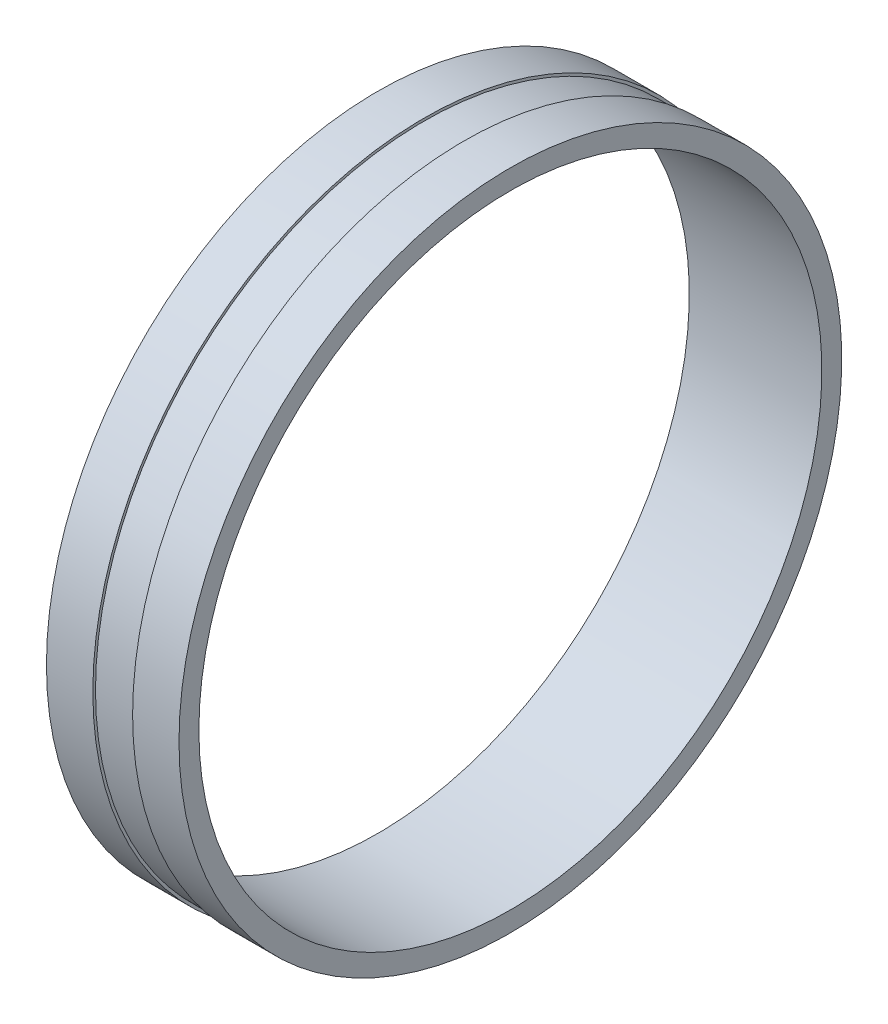
ISO-10303-21;
HEADER;
FILE_DESCRIPTION(('STEP AP214'),'2;1');
FILE_NAME('part.step','',(''),(''),'','','');
FILE_SCHEMA(('AUTOMOTIVE_DESIGN { 1 0 10303 214 1 1 1 1 }'));
ENDSEC;
DATA;
#1=APPLICATION_CONTEXT('core data for automotive mechanical design processes');
#2=APPLICATION_PROTOCOL_DEFINITION('international standard','automotive_design',2000,#1);
#3=PRODUCT_CONTEXT('',#1,'mechanical');
#4=PRODUCT('Part','Part','',(#3));
#5=PRODUCT_RELATED_PRODUCT_CATEGORY('part','',(#4));
#6=PRODUCT_DEFINITION_FORMATION('','',#4);
#7=PRODUCT_DEFINITION_CONTEXT('part definition',#1,'design');
#8=PRODUCT_DEFINITION('design','',#6,#7);
#9=PRODUCT_DEFINITION_SHAPE('','',#8);
#10=(LENGTH_UNIT() NAMED_UNIT(*) SI_UNIT(.MILLI.,.METRE.));
#11=(NAMED_UNIT(*) PLANE_ANGLE_UNIT() SI_UNIT($,.RADIAN.));
#12=(NAMED_UNIT(*) SI_UNIT($,.STERADIAN.) SOLID_ANGLE_UNIT());
#13=UNCERTAINTY_MEASURE_WITH_UNIT(LENGTH_MEASURE(1.E-05),#10,'distance_accuracy_value','');
#14=(GEOMETRIC_REPRESENTATION_CONTEXT(3) GLOBAL_UNCERTAINTY_ASSIGNED_CONTEXT((#13)) GLOBAL_UNIT_ASSIGNED_CONTEXT((#10,
#11,#12)) REPRESENTATION_CONTEXT('',''));
#15=CARTESIAN_POINT('',(0.,0.,0.));
#16=DIRECTION('',(0.,0.,1.));
#17=DIRECTION('',(1.,0.,0.));
#18=AXIS2_PLACEMENT_3D('',#15,#16,#17);
#19=CARTESIAN_POINT('',(-425.537809827157,-177.948573752576,0.));
#20=DIRECTION('',(1.,0.,0.));
#21=DIRECTION('',(0.,0.,-1.));
#22=AXIS2_PLACEMENT_3D('',#19,#20,#21);
#23=PLANE('',#22);
#24=CARTESIAN_POINT('',(-425.537809827157,-202.948573752576,0.));
#25=DIRECTION('',(-1.,0.,0.));
#26=DIRECTION('',(0.,0.,1.));
#27=AXIS2_PLACEMENT_3D('',#24,#25,#26);
#28=CIRCLE('',#27,23.5);
#29=CARTESIAN_POINT('',(-425.537809827157,-202.948573752576,23.5));
#30=VERTEX_POINT('',#29);
#31=EDGE_CURVE('E10',#30,#30,#28,.T.);
#32=ORIENTED_EDGE('',*,*,#31,.F.);
#33=EDGE_LOOP('',(#32));
#34=FACE_BOUND('',#33,.T.);
#35=CARTESIAN_POINT('',(-425.537809827157,-202.948573752576,0.));
#36=DIRECTION('',(-1.,0.,0.));
#37=DIRECTION('',(0.,0.,1.));
#38=AXIS2_PLACEMENT_3D('',#35,#36,#37);
#39=CIRCLE('',#38,25.);
#40=CARTESIAN_POINT('',(-425.537809827157,-202.948573752576,25.));
#41=VERTEX_POINT('',#40);
#42=EDGE_CURVE('E61',#41,#41,#39,.T.);
#43=ORIENTED_EDGE('',*,*,#42,.T.);
#44=EDGE_LOOP('',(#43));
#45=FACE_BOUND('',#44,.T.);
#46=ADVANCED_FACE('F33',(#34,#45),#23,.F.);
#47=CARTESIAN_POINT('',(-411.499100779652,-202.948573752576,0.));
#48=DIRECTION('',(-1.,0.,0.));
#49=DIRECTION('',(0.,0.,1.));
#50=AXIS2_PLACEMENT_3D('',#47,#48,#49);
#51=CYLINDRICAL_SURFACE('',#50,23.5);
#52=CARTESIAN_POINT('',(-415.537809827157,-202.948573752576,0.));
#53=DIRECTION('',(-1.,0.,0.));
#54=DIRECTION('',(0.,0.,1.));
#55=AXIS2_PLACEMENT_3D('',#52,#53,#54);
#56=CIRCLE('',#55,23.5);
#57=CARTESIAN_POINT('',(-415.537809827157,-202.948573752576,23.5));
#58=VERTEX_POINT('',#57);
#59=EDGE_CURVE('E39',#58,#58,#56,.T.);
#60=ORIENTED_EDGE('',*,*,#59,.F.);
#61=EDGE_LOOP('',(#60));
#62=FACE_BOUND('',#61,.T.);
#63=ORIENTED_EDGE('',*,*,#31,.T.);
#64=EDGE_LOOP('',(#63));
#65=FACE_BOUND('',#64,.T.);
#66=ADVANCED_FACE('F98',(#62,#65),#51,.F.);
#67=CARTESIAN_POINT('',(-415.537809827157,-177.948573752576,0.));
#68=DIRECTION('',(-1.,0.,0.));
#69=DIRECTION('',(0.,0.,1.));
#70=AXIS2_PLACEMENT_3D('',#67,#68,#69);
#71=PLANE('',#70);
#72=CARTESIAN_POINT('',(-415.537809827157,-202.948573752576,0.));
#73=DIRECTION('',(-1.,0.,0.));
#74=DIRECTION('',(0.,0.,1.));
#75=AXIS2_PLACEMENT_3D('',#72,#73,#74);
#76=CIRCLE('',#75,25.);
#77=CARTESIAN_POINT('',(-415.537809827157,-202.948573752576,25.));
#78=VERTEX_POINT('',#77);
#79=EDGE_CURVE('E43',#78,#78,#76,.T.);
#80=ORIENTED_EDGE('',*,*,#79,.F.);
#81=EDGE_LOOP('',(#80));
#82=FACE_BOUND('',#81,.T.);
#83=ORIENTED_EDGE('',*,*,#59,.T.);
#84=EDGE_LOOP('',(#83));
#85=FACE_BOUND('',#84,.T.);
#86=ADVANCED_FACE('F93',(#82,#85),#71,.F.);
#87=CARTESIAN_POINT('',(-411.499100779652,-202.948573752576,0.));
#88=DIRECTION('',(-1.,0.,0.));
#89=DIRECTION('',(0.,0.,1.));
#90=AXIS2_PLACEMENT_3D('',#87,#88,#89);
#91=CYLINDRICAL_SURFACE('',#90,25.);
#92=CARTESIAN_POINT('',(-419.037809827157,-202.948573752576,0.));
#93=DIRECTION('',(-1.,0.,0.));
#94=DIRECTION('',(0.,0.,1.));
#95=AXIS2_PLACEMENT_3D('',#92,#93,#94);
#96=CIRCLE('',#95,25.);
#97=CARTESIAN_POINT('',(-419.037809827157,-202.948573752576,25.));
#98=VERTEX_POINT('',#97);
#99=EDGE_CURVE('E47',#98,#98,#96,.T.);
#100=ORIENTED_EDGE('',*,*,#99,.F.);
#101=EDGE_LOOP('',(#100));
#102=FACE_BOUND('',#101,.T.);
#103=ORIENTED_EDGE('',*,*,#79,.T.);
#104=EDGE_LOOP('',(#103));
#105=FACE_BOUND('',#104,.T.);
#106=ADVANCED_FACE('F87',(#102,#105),#91,.T.);
#107=CARTESIAN_POINT('',(-419.037809827157,-177.948573752576,0.));
#108=DIRECTION('',(1.,0.,0.));
#109=DIRECTION('',(0.,0.,-1.));
#110=AXIS2_PLACEMENT_3D('',#107,#108,#109);
#111=PLANE('',#110);
#112=CARTESIAN_POINT('',(-419.037809827157,-202.948573752576,0.));
#113=DIRECTION('',(-1.,0.,0.));
#114=DIRECTION('',(0.,0.,1.));
#115=AXIS2_PLACEMENT_3D('',#112,#113,#114);
#116=CIRCLE('',#115,24.8);
#117=CARTESIAN_POINT('',(-419.037809827157,-202.948573752576,24.8));
#118=VERTEX_POINT('',#117);
#119=EDGE_CURVE('E52',#118,#118,#116,.T.);
#120=ORIENTED_EDGE('',*,*,#119,.F.);
#121=EDGE_LOOP('',(#120));
#122=FACE_BOUND('',#121,.T.);
#123=ORIENTED_EDGE('',*,*,#99,.T.);
#124=EDGE_LOOP('',(#123));
#125=FACE_BOUND('',#124,.T.);
#126=ADVANCED_FACE('F81',(#122,#125),#111,.F.);
#127=CARTESIAN_POINT('',(-411.499100779652,-202.948573752576,0.));
#128=DIRECTION('',(-1.,0.,0.));
#129=DIRECTION('',(0.,0.,1.));
#130=AXIS2_PLACEMENT_3D('',#127,#128,#129);
#131=CYLINDRICAL_SURFACE('',#130,24.8);
#132=CARTESIAN_POINT('',(-422.037809827157,-202.948573752576,0.));
#133=DIRECTION('',(-1.,0.,0.));
#134=DIRECTION('',(0.,0.,1.));
#135=AXIS2_PLACEMENT_3D('',#132,#133,#134);
#136=CIRCLE('',#135,24.8);
#137=CARTESIAN_POINT('',(-422.037809827157,-202.948573752576,24.8));
#138=VERTEX_POINT('',#137);
#139=EDGE_CURVE('E55',#138,#138,#136,.T.);
#140=ORIENTED_EDGE('',*,*,#139,.F.);
#141=EDGE_LOOP('',(#140));
#142=FACE_BOUND('',#141,.T.);
#143=ORIENTED_EDGE('',*,*,#119,.T.);
#144=EDGE_LOOP('',(#143));
#145=FACE_BOUND('',#144,.T.);
#146=ADVANCED_FACE('F75',(#142,#145),#131,.T.);
#147=CARTESIAN_POINT('',(-422.037809827157,-177.948573752576,0.));
#148=DIRECTION('',(-1.,0.,0.));
#149=DIRECTION('',(0.,0.,1.));
#150=AXIS2_PLACEMENT_3D('',#147,#148,#149);
#151=PLANE('',#150);
#152=CARTESIAN_POINT('',(-422.037809827157,-202.948573752576,0.));
#153=DIRECTION('',(-1.,0.,0.));
#154=DIRECTION('',(0.,0.,1.));
#155=AXIS2_PLACEMENT_3D('',#152,#153,#154);
#156=CIRCLE('',#155,25.);
#157=CARTESIAN_POINT('',(-422.037809827157,-202.948573752576,25.));
#158=VERTEX_POINT('',#157);
#159=EDGE_CURVE('E58',#158,#158,#156,.T.);
#160=ORIENTED_EDGE('',*,*,#159,.F.);
#161=EDGE_LOOP('',(#160));
#162=FACE_BOUND('',#161,.T.);
#163=ORIENTED_EDGE('',*,*,#139,.T.);
#164=EDGE_LOOP('',(#163));
#165=FACE_BOUND('',#164,.T.);
#166=ADVANCED_FACE('F69',(#162,#165),#151,.F.);
#167=CARTESIAN_POINT('',(-411.499100779652,-202.948573752576,0.));
#168=DIRECTION('',(-1.,0.,0.));
#169=DIRECTION('',(0.,0.,1.));
#170=AXIS2_PLACEMENT_3D('',#167,#168,#169);
#171=CYLINDRICAL_SURFACE('',#170,25.);
#172=ORIENTED_EDGE('',*,*,#42,.F.);
#173=EDGE_LOOP('',(#172));
#174=FACE_BOUND('',#173,.T.);
#175=ORIENTED_EDGE('',*,*,#159,.T.);
#176=EDGE_LOOP('',(#175));
#177=FACE_BOUND('',#176,.T.);
#178=ADVANCED_FACE('F66',(#174,#177),#171,.T.);
#179=CLOSED_SHELL('',(#46,#66,#86,#106,#126,#146,#166,#178));
#180=MANIFOLD_SOLID_BREP('B2',#179);
#181=ADVANCED_BREP_SHAPE_REPRESENTATION('',(#18,#180),#14);
#182=SHAPE_DEFINITION_REPRESENTATION(#9,#181);
ENDSEC;
END-ISO-10303-21;
